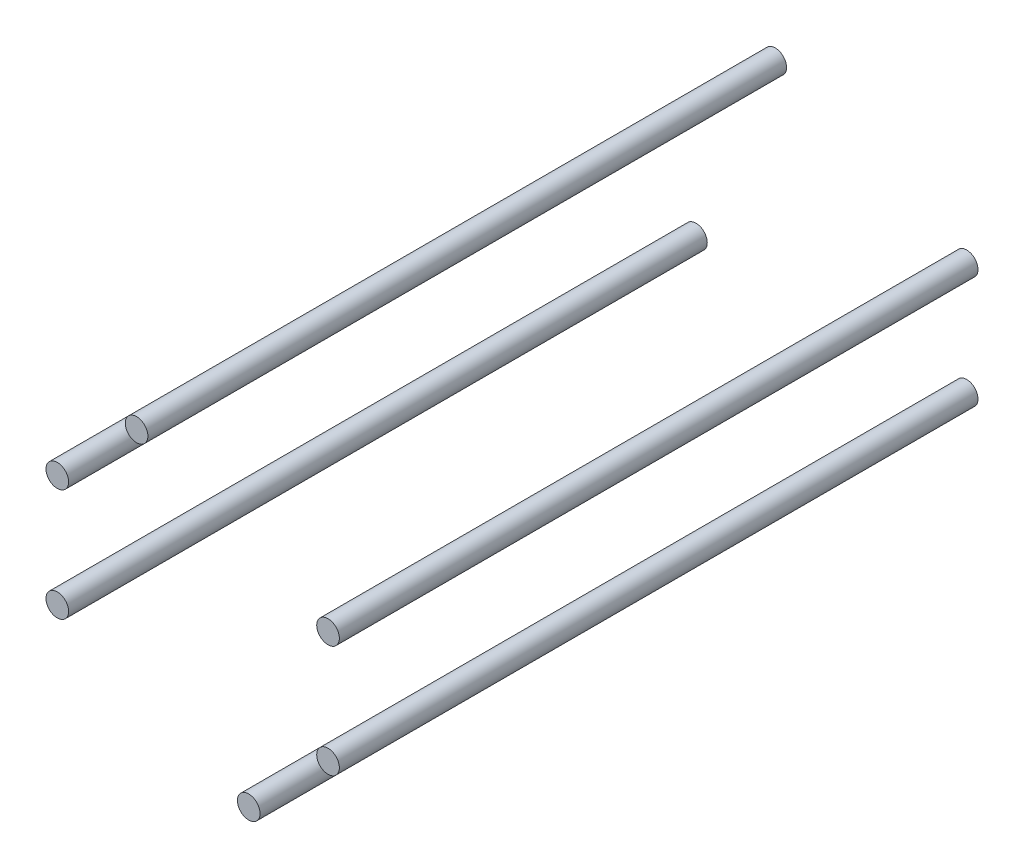
ISO-10303-21;
HEADER;
FILE_DESCRIPTION(('STEP AP214'),'2;1');
FILE_NAME('part.step','',(''),(''),'','','');
FILE_SCHEMA(('AUTOMOTIVE_DESIGN { 1 0 10303 214 1 1 1 1 }'));
ENDSEC;
DATA;
#1=APPLICATION_CONTEXT('core data for automotive mechanical design processes');
#2=APPLICATION_PROTOCOL_DEFINITION('international standard','automotive_design',2000,#1);
#3=PRODUCT_CONTEXT('',#1,'mechanical');
#4=PRODUCT('Part','Part','',(#3));
#5=PRODUCT_RELATED_PRODUCT_CATEGORY('part','',(#4));
#6=PRODUCT_DEFINITION_FORMATION('','',#4);
#7=PRODUCT_DEFINITION_CONTEXT('part definition',#1,'design');
#8=PRODUCT_DEFINITION('design','',#6,#7);
#9=PRODUCT_DEFINITION_SHAPE('','',#8);
#10=(LENGTH_UNIT() NAMED_UNIT(*) SI_UNIT(.MILLI.,.METRE.));
#11=(NAMED_UNIT(*) PLANE_ANGLE_UNIT() SI_UNIT($,.RADIAN.));
#12=(NAMED_UNIT(*) SI_UNIT($,.STERADIAN.) SOLID_ANGLE_UNIT());
#13=UNCERTAINTY_MEASURE_WITH_UNIT(LENGTH_MEASURE(1.E-05),#10,'distance_accuracy_value','');
#14=(GEOMETRIC_REPRESENTATION_CONTEXT(3) GLOBAL_UNCERTAINTY_ASSIGNED_CONTEXT((#13)) GLOBAL_UNIT_ASSIGNED_CONTEXT((#10,
#11,#12)) REPRESENTATION_CONTEXT('',''));
#15=CARTESIAN_POINT('',(0.,0.,0.));
#16=DIRECTION('',(0.,0.,1.));
#17=DIRECTION('',(1.,0.,0.));
#18=AXIS2_PLACEMENT_3D('',#15,#16,#17);
#19=CARTESIAN_POINT('',(1.115,-2.691848122046,-12.7));
#20=DIRECTION('',(0.,0.,1.));
#21=DIRECTION('',(1.,0.,0.));
#22=AXIS2_PLACEMENT_3D('',#19,#20,#21);
#23=PLANE('',#22);
#24=CARTESIAN_POINT('',(1.115,-2.691848122046,-12.7));
#25=DIRECTION('',(0.,0.,1.));
#26=DIRECTION('',(1.,0.,0.));
#27=AXIS2_PLACEMENT_3D('',#24,#25,#26);
#28=CIRCLE('',#27,0.225);
#29=CARTESIAN_POINT('',(1.34,-2.691848122046,-12.7));
#30=VERTEX_POINT('',#29);
#31=EDGE_CURVE('P0_E22',#30,#30,#28,.T.);
#32=ORIENTED_EDGE('',*,*,#31,.F.);
#33=EDGE_LOOP('',(#32));
#34=FACE_BOUND('',#33,.T.);
#35=ADVANCED_FACE('P0_F15',(#34),#23,.F.);
#36=CARTESIAN_POINT('',(1.115,-2.691848122046,0.));
#37=DIRECTION('',(0.,0.,1.));
#38=DIRECTION('',(1.,0.,0.));
#39=AXIS2_PLACEMENT_3D('',#36,#37,#38);
#40=PLANE('',#39);
#41=CARTESIAN_POINT('',(1.115,-2.691848122046,0.));
#42=DIRECTION('',(0.,0.,1.));
#43=DIRECTION('',(1.,0.,0.));
#44=AXIS2_PLACEMENT_3D('',#41,#42,#43);
#45=CIRCLE('',#44,0.225);
#46=CARTESIAN_POINT('',(1.34,-2.691848122046,0.));
#47=VERTEX_POINT('',#46);
#48=EDGE_CURVE('P0_E10',#47,#47,#45,.T.);
#49=ORIENTED_EDGE('',*,*,#48,.T.);
#50=EDGE_LOOP('',(#49));
#51=FACE_BOUND('',#50,.T.);
#52=ADVANCED_FACE('P0_F39',(#51),#40,.T.);
#53=CARTESIAN_POINT('',(1.115,-2.691848122046,0.));
#54=DIRECTION('',(0.,0.,1.));
#55=DIRECTION('',(1.,0.,0.));
#56=AXIS2_PLACEMENT_3D('',#53,#54,#55);
#57=CYLINDRICAL_SURFACE('',#56,0.225);
#58=ORIENTED_EDGE('',*,*,#31,.T.);
#59=EDGE_LOOP('',(#58));
#60=FACE_BOUND('',#59,.T.);
#61=ORIENTED_EDGE('',*,*,#48,.F.);
#62=EDGE_LOOP('',(#61));
#63=FACE_BOUND('',#62,.T.);
#64=ADVANCED_FACE('P0_F34',(#60,#63),#57,.T.);
#65=CLOSED_SHELL('',(#35,#52,#64));
#66=MANIFOLD_SOLID_BREP('P0_B1',#65);
#67=CARTESIAN_POINT('',(1.115,-2.691848122046,-12.7));
#68=DIRECTION('',(0.,0.,1.));
#69=DIRECTION('',(1.,0.,0.));
#70=AXIS2_PLACEMENT_3D('',#67,#68,#69);
#71=PLANE('',#70);
#72=CARTESIAN_POINT('',(2.691848122046,-1.115,-12.7));
#73=DIRECTION('',(0.,0.,1.));
#74=DIRECTION('',(1.,0.,0.));
#75=AXIS2_PLACEMENT_3D('',#72,#73,#74);
#76=CIRCLE('',#75,0.225);
#77=CARTESIAN_POINT('',(2.916848122046,-1.115,-12.7));
#78=VERTEX_POINT('',#77);
#79=EDGE_CURVE('P1_E22',#78,#78,#76,.T.);
#80=ORIENTED_EDGE('',*,*,#79,.F.);
#81=EDGE_LOOP('',(#80));
#82=FACE_BOUND('',#81,.T.);
#83=ADVANCED_FACE('P1_F15',(#82),#71,.F.);
#84=CARTESIAN_POINT('',(1.115,-2.691848122046,0.));
#85=DIRECTION('',(0.,0.,1.));
#86=DIRECTION('',(1.,0.,0.));
#87=AXIS2_PLACEMENT_3D('',#84,#85,#86);
#88=PLANE('',#87);
#89=CARTESIAN_POINT('',(2.691848122046,-1.115,0.));
#90=DIRECTION('',(0.,0.,1.));
#91=DIRECTION('',(1.,0.,0.));
#92=AXIS2_PLACEMENT_3D('',#89,#90,#91);
#93=CIRCLE('',#92,0.225);
#94=CARTESIAN_POINT('',(2.916848122046,-1.115,0.));
#95=VERTEX_POINT('',#94);
#96=EDGE_CURVE('P1_E10',#95,#95,#93,.T.);
#97=ORIENTED_EDGE('',*,*,#96,.T.);
#98=EDGE_LOOP('',(#97));
#99=FACE_BOUND('',#98,.T.);
#100=ADVANCED_FACE('P1_F39',(#99),#88,.T.);
#101=CARTESIAN_POINT('',(2.691848122046,-1.115,0.));
#102=DIRECTION('',(0.,0.,1.));
#103=DIRECTION('',(1.,0.,0.));
#104=AXIS2_PLACEMENT_3D('',#101,#102,#103);
#105=CYLINDRICAL_SURFACE('',#104,0.225);
#106=ORIENTED_EDGE('',*,*,#79,.T.);
#107=EDGE_LOOP('',(#106));
#108=FACE_BOUND('',#107,.T.);
#109=ORIENTED_EDGE('',*,*,#96,.F.);
#110=EDGE_LOOP('',(#109));
#111=FACE_BOUND('',#110,.T.);
#112=ADVANCED_FACE('P1_F34',(#108,#111),#105,.T.);
#113=CLOSED_SHELL('',(#83,#100,#112));
#114=MANIFOLD_SOLID_BREP('P1_B1',#113);
#115=CARTESIAN_POINT('',(1.115,-2.691848122046,-12.7));
#116=DIRECTION('',(0.,0.,1.));
#117=DIRECTION('',(1.,0.,0.));
#118=AXIS2_PLACEMENT_3D('',#115,#116,#117);
#119=PLANE('',#118);
#120=CARTESIAN_POINT('',(2.691848122046,1.115,-12.7));
#121=DIRECTION('',(0.,0.,1.));
#122=DIRECTION('',(1.,0.,0.));
#123=AXIS2_PLACEMENT_3D('',#120,#121,#122);
#124=CIRCLE('',#123,0.225);
#125=CARTESIAN_POINT('',(2.916848122046,1.115,-12.7));
#126=VERTEX_POINT('',#125);
#127=EDGE_CURVE('P2_E22',#126,#126,#124,.T.);
#128=ORIENTED_EDGE('',*,*,#127,.F.);
#129=EDGE_LOOP('',(#128));
#130=FACE_BOUND('',#129,.T.);
#131=ADVANCED_FACE('P2_F15',(#130),#119,.F.);
#132=CARTESIAN_POINT('',(1.115,-2.691848122046,0.));
#133=DIRECTION('',(0.,0.,1.));
#134=DIRECTION('',(1.,0.,0.));
#135=AXIS2_PLACEMENT_3D('',#132,#133,#134);
#136=PLANE('',#135);
#137=CARTESIAN_POINT('',(2.691848122046,1.115,0.));
#138=DIRECTION('',(0.,0.,1.));
#139=DIRECTION('',(1.,0.,0.));
#140=AXIS2_PLACEMENT_3D('',#137,#138,#139);
#141=CIRCLE('',#140,0.225);
#142=CARTESIAN_POINT('',(2.916848122046,1.115,0.));
#143=VERTEX_POINT('',#142);
#144=EDGE_CURVE('P2_E10',#143,#143,#141,.T.);
#145=ORIENTED_EDGE('',*,*,#144,.T.);
#146=EDGE_LOOP('',(#145));
#147=FACE_BOUND('',#146,.T.);
#148=ADVANCED_FACE('P2_F39',(#147),#136,.T.);
#149=CARTESIAN_POINT('',(2.691848122046,1.115,0.));
#150=DIRECTION('',(0.,0.,1.));
#151=DIRECTION('',(1.,0.,0.));
#152=AXIS2_PLACEMENT_3D('',#149,#150,#151);
#153=CYLINDRICAL_SURFACE('',#152,0.225);
#154=ORIENTED_EDGE('',*,*,#127,.T.);
#155=EDGE_LOOP('',(#154));
#156=FACE_BOUND('',#155,.T.);
#157=ORIENTED_EDGE('',*,*,#144,.F.);
#158=EDGE_LOOP('',(#157));
#159=FACE_BOUND('',#158,.T.);
#160=ADVANCED_FACE('P2_F34',(#156,#159),#153,.T.);
#161=CLOSED_SHELL('',(#131,#148,#160));
#162=MANIFOLD_SOLID_BREP('P2_B1',#161);
#163=CARTESIAN_POINT('',(1.115,-2.691848122046,-12.7));
#164=DIRECTION('',(0.,0.,1.));
#165=DIRECTION('',(1.,0.,0.));
#166=AXIS2_PLACEMENT_3D('',#163,#164,#165);
#167=PLANE('',#166);
#168=CARTESIAN_POINT('',(-1.115,2.691848122046,-12.7));
#169=DIRECTION('',(0.,0.,1.));
#170=DIRECTION('',(1.,0.,0.));
#171=AXIS2_PLACEMENT_3D('',#168,#169,#170);
#172=CIRCLE('',#171,0.225);
#173=CARTESIAN_POINT('',(-0.89,2.691848122046,-12.7));
#174=VERTEX_POINT('',#173);
#175=EDGE_CURVE('P3_E22',#174,#174,#172,.T.);
#176=ORIENTED_EDGE('',*,*,#175,.F.);
#177=EDGE_LOOP('',(#176));
#178=FACE_BOUND('',#177,.T.);
#179=ADVANCED_FACE('P3_F15',(#178),#167,.F.);
#180=CARTESIAN_POINT('',(1.115,-2.691848122046,0.));
#181=DIRECTION('',(0.,0.,1.));
#182=DIRECTION('',(1.,0.,0.));
#183=AXIS2_PLACEMENT_3D('',#180,#181,#182);
#184=PLANE('',#183);
#185=CARTESIAN_POINT('',(-1.115,2.691848122046,0.));
#186=DIRECTION('',(0.,0.,1.));
#187=DIRECTION('',(1.,0.,0.));
#188=AXIS2_PLACEMENT_3D('',#185,#186,#187);
#189=CIRCLE('',#188,0.225);
#190=CARTESIAN_POINT('',(-0.89,2.691848122046,0.));
#191=VERTEX_POINT('',#190);
#192=EDGE_CURVE('P3_E10',#191,#191,#189,.T.);
#193=ORIENTED_EDGE('',*,*,#192,.T.);
#194=EDGE_LOOP('',(#193));
#195=FACE_BOUND('',#194,.T.);
#196=ADVANCED_FACE('P3_F39',(#195),#184,.T.);
#197=CARTESIAN_POINT('',(-1.115,2.691848122046,0.));
#198=DIRECTION('',(0.,0.,1.));
#199=DIRECTION('',(1.,0.,0.));
#200=AXIS2_PLACEMENT_3D('',#197,#198,#199);
#201=CYLINDRICAL_SURFACE('',#200,0.225);
#202=ORIENTED_EDGE('',*,*,#175,.T.);
#203=EDGE_LOOP('',(#202));
#204=FACE_BOUND('',#203,.T.);
#205=ORIENTED_EDGE('',*,*,#192,.F.);
#206=EDGE_LOOP('',(#205));
#207=FACE_BOUND('',#206,.T.);
#208=ADVANCED_FACE('P3_F34',(#204,#207),#201,.T.);
#209=CLOSED_SHELL('',(#179,#196,#208));
#210=MANIFOLD_SOLID_BREP('P3_B1',#209);
#211=CARTESIAN_POINT('',(1.115,-2.691848122046,-12.7));
#212=DIRECTION('',(0.,0.,1.));
#213=DIRECTION('',(1.,0.,0.));
#214=AXIS2_PLACEMENT_3D('',#211,#212,#213);
#215=PLANE('',#214);
#216=CARTESIAN_POINT('',(-2.691848122046,1.115,-12.7));
#217=DIRECTION('',(0.,0.,1.));
#218=DIRECTION('',(1.,0.,0.));
#219=AXIS2_PLACEMENT_3D('',#216,#217,#218);
#220=CIRCLE('',#219,0.225);
#221=CARTESIAN_POINT('',(-2.466848122046,1.115,-12.7));
#222=VERTEX_POINT('',#221);
#223=EDGE_CURVE('P4_E23',#222,#222,#220,.T.);
#224=ORIENTED_EDGE('',*,*,#223,.F.);
#225=EDGE_LOOP('',(#224));
#226=FACE_BOUND('',#225,.T.);
#227=ADVANCED_FACE('P4_F15',(#226),#215,.F.);
#228=CARTESIAN_POINT('',(1.115,-2.691848122046,0.));
#229=DIRECTION('',(0.,0.,1.));
#230=DIRECTION('',(1.,0.,0.));
#231=AXIS2_PLACEMENT_3D('',#228,#229,#230);
#232=PLANE('',#231);
#233=CARTESIAN_POINT('',(-2.691848122046,1.115,0.));
#234=DIRECTION('',(0.,0.,1.));
#235=DIRECTION('',(1.,0.,0.));
#236=AXIS2_PLACEMENT_3D('',#233,#234,#235);
#237=CIRCLE('',#236,0.225);
#238=CARTESIAN_POINT('',(-2.466848122046,1.115,0.));
#239=VERTEX_POINT('',#238);
#240=EDGE_CURVE('P4_E10',#239,#239,#237,.T.);
#241=ORIENTED_EDGE('',*,*,#240,.T.);
#242=EDGE_LOOP('',(#241));
#243=FACE_BOUND('',#242,.T.);
#244=ADVANCED_FACE('P4_F17',(#243),#232,.T.);
#245=CARTESIAN_POINT('',(-2.691848122046,1.115,0.));
#246=DIRECTION('',(0.,0.,1.));
#247=DIRECTION('',(1.,0.,0.));
#248=AXIS2_PLACEMENT_3D('',#245,#246,#247);
#249=CYLINDRICAL_SURFACE('',#248,0.225);
#250=ORIENTED_EDGE('',*,*,#223,.T.);
#251=EDGE_LOOP('',(#250));
#252=FACE_BOUND('',#251,.T.);
#253=ORIENTED_EDGE('',*,*,#240,.F.);
#254=EDGE_LOOP('',(#253));
#255=FACE_BOUND('',#254,.T.);
#256=ADVANCED_FACE('P4_F38',(#252,#255),#249,.T.);
#257=CLOSED_SHELL('',(#227,#244,#256));
#258=MANIFOLD_SOLID_BREP('P4_B1',#257);
#259=CARTESIAN_POINT('',(1.115,-2.691848122046,-12.7));
#260=DIRECTION('',(0.,0.,1.));
#261=DIRECTION('',(1.,0.,0.));
#262=AXIS2_PLACEMENT_3D('',#259,#260,#261);
#263=PLANE('',#262);
#264=CARTESIAN_POINT('',(-2.691848122046,-1.115,-12.7));
#265=DIRECTION('',(0.,0.,1.));
#266=DIRECTION('',(1.,0.,0.));
#267=AXIS2_PLACEMENT_3D('',#264,#265,#266);
#268=CIRCLE('',#267,0.225);
#269=CARTESIAN_POINT('',(-2.466848122046,-1.115,-12.7));
#270=VERTEX_POINT('',#269);
#271=EDGE_CURVE('P5_E22',#270,#270,#268,.T.);
#272=ORIENTED_EDGE('',*,*,#271,.F.);
#273=EDGE_LOOP('',(#272));
#274=FACE_BOUND('',#273,.T.);
#275=ADVANCED_FACE('P5_F15',(#274),#263,.F.);
#276=CARTESIAN_POINT('',(1.115,-2.691848122046,0.));
#277=DIRECTION('',(0.,0.,1.));
#278=DIRECTION('',(1.,0.,0.));
#279=AXIS2_PLACEMENT_3D('',#276,#277,#278);
#280=PLANE('',#279);
#281=CARTESIAN_POINT('',(-2.691848122046,-1.115,0.));
#282=DIRECTION('',(0.,0.,1.));
#283=DIRECTION('',(1.,0.,0.));
#284=AXIS2_PLACEMENT_3D('',#281,#282,#283);
#285=CIRCLE('',#284,0.225);
#286=CARTESIAN_POINT('',(-2.466848122046,-1.115,0.));
#287=VERTEX_POINT('',#286);
#288=EDGE_CURVE('P5_E10',#287,#287,#285,.T.);
#289=ORIENTED_EDGE('',*,*,#288,.T.);
#290=EDGE_LOOP('',(#289));
#291=FACE_BOUND('',#290,.T.);
#292=ADVANCED_FACE('P5_F39',(#291),#280,.T.);
#293=CARTESIAN_POINT('',(-2.691848122046,-1.115,0.));
#294=DIRECTION('',(0.,0.,1.));
#295=DIRECTION('',(1.,0.,0.));
#296=AXIS2_PLACEMENT_3D('',#293,#294,#295);
#297=CYLINDRICAL_SURFACE('',#296,0.225);
#298=ORIENTED_EDGE('',*,*,#271,.T.);
#299=EDGE_LOOP('',(#298));
#300=FACE_BOUND('',#299,.T.);
#301=ORIENTED_EDGE('',*,*,#288,.F.);
#302=EDGE_LOOP('',(#301));
#303=FACE_BOUND('',#302,.T.);
#304=ADVANCED_FACE('P5_F34',(#300,#303),#297,.T.);
#305=CLOSED_SHELL('',(#275,#292,#304));
#306=MANIFOLD_SOLID_BREP('P5_B1',#305);
#307=ADVANCED_BREP_SHAPE_REPRESENTATION('',(#18,#66,#114,#162,#210,#258,#306),#14);
#308=SHAPE_DEFINITION_REPRESENTATION(#9,#307);
ENDSEC;
END-ISO-10303-21;
